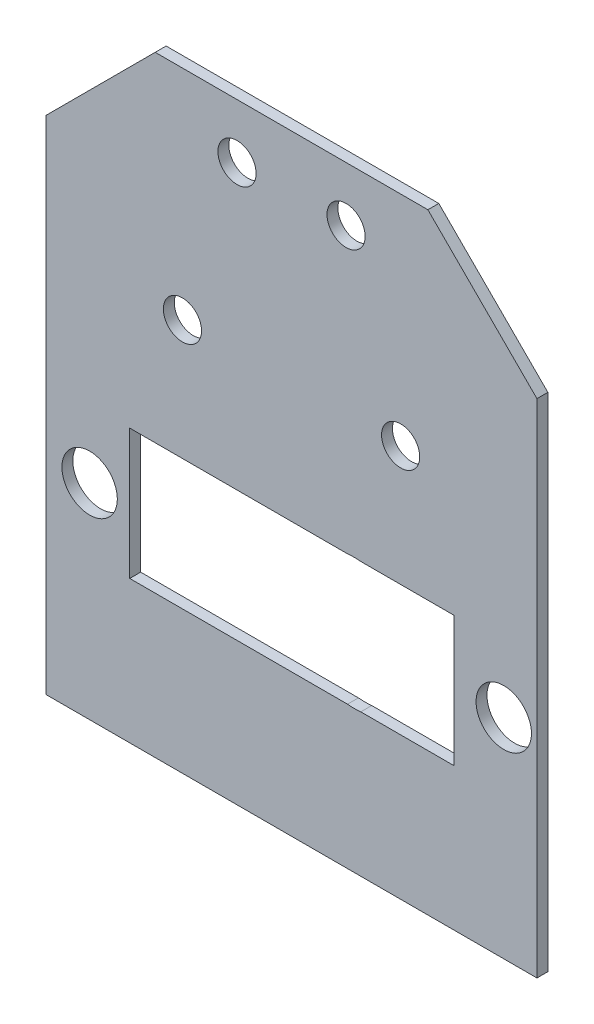
ISO-10303-21;
HEADER;
FILE_DESCRIPTION(('STEP AP214'),'2;1');
FILE_NAME('part.step','',(''),(''),'','','');
FILE_SCHEMA(('AUTOMOTIVE_DESIGN { 1 0 10303 214 1 1 1 1 }'));
ENDSEC;
DATA;
#1=APPLICATION_CONTEXT('core data for automotive mechanical design processes');
#2=APPLICATION_PROTOCOL_DEFINITION('international standard','automotive_design',2000,#1);
#3=PRODUCT_CONTEXT('',#1,'mechanical');
#4=PRODUCT('Part','Part','',(#3));
#5=PRODUCT_RELATED_PRODUCT_CATEGORY('part','',(#4));
#6=PRODUCT_DEFINITION_FORMATION('','',#4);
#7=PRODUCT_DEFINITION_CONTEXT('part definition',#1,'design');
#8=PRODUCT_DEFINITION('design','',#6,#7);
#9=PRODUCT_DEFINITION_SHAPE('','',#8);
#10=(LENGTH_UNIT() NAMED_UNIT(*) SI_UNIT(.MILLI.,.METRE.));
#11=(NAMED_UNIT(*) PLANE_ANGLE_UNIT() SI_UNIT($,.RADIAN.));
#12=(NAMED_UNIT(*) SI_UNIT($,.STERADIAN.) SOLID_ANGLE_UNIT());
#13=UNCERTAINTY_MEASURE_WITH_UNIT(LENGTH_MEASURE(1.E-05),#10,'distance_accuracy_value','');
#14=(GEOMETRIC_REPRESENTATION_CONTEXT(3) GLOBAL_UNCERTAINTY_ASSIGNED_CONTEXT((#13)) GLOBAL_UNIT_ASSIGNED_CONTEXT((#10,
#11,#12)) REPRESENTATION_CONTEXT('',''));
#15=CARTESIAN_POINT('',(0.,0.,0.));
#16=DIRECTION('',(0.,0.,1.));
#17=DIRECTION('',(1.,0.,0.));
#18=AXIS2_PLACEMENT_3D('',#15,#16,#17);
#19=CARTESIAN_POINT('',(5.73999999999999,-23.2649392617659,-1.));
#20=DIRECTION('',(0.,0.,1.));
#21=DIRECTION('',(1.,0.,0.));
#22=AXIS2_PLACEMENT_3D('',#19,#20,#21);
#23=CYLINDRICAL_SURFACE('',#22,6.);
#24=CARTESIAN_POINT('',(5.73999999999999,-23.2649392617659,0.));
#25=DIRECTION('',(0.,0.,1.));
#26=DIRECTION('',(1.,0.,0.));
#27=AXIS2_PLACEMENT_3D('',#24,#25,#26);
#28=CIRCLE('',#27,6.);
#29=CARTESIAN_POINT('',(6.34912970704187,-17.295939261766,0.));
#30=VERTEX_POINT('',#29);
#31=CARTESIAN_POINT('',(5.13087029295812,-17.295939261766,0.));
#32=VERTEX_POINT('',#31);
#33=EDGE_CURVE('E194',#30,#32,#28,.T.);
#34=ORIENTED_EDGE('',*,*,#33,.T.);
#35=DIRECTION('',(0.,0.,1.));
#36=VECTOR('',#35,1.);
#37=CARTESIAN_POINT('',(5.13087029295812,-17.295939261766,-1.));
#38=LINE('',#37,#36);
#39=CARTESIAN_POINT('',(5.13087029295812,-17.295939261766,-1.));
#40=VERTEX_POINT('',#39);
#41=EDGE_CURVE('E11',#32,#40,#38,.F.);
#42=ORIENTED_EDGE('',*,*,#41,.T.);
#43=CARTESIAN_POINT('',(5.73999999999999,-23.2649392617659,-1.));
#44=DIRECTION('',(0.,0.,1.));
#45=DIRECTION('',(1.,0.,0.));
#46=AXIS2_PLACEMENT_3D('',#43,#44,#45);
#47=CIRCLE('',#46,6.);
#48=CARTESIAN_POINT('',(6.34912970704187,-17.295939261766,-1.));
#49=VERTEX_POINT('',#48);
#50=EDGE_CURVE('E190',#49,#40,#47,.T.);
#51=ORIENTED_EDGE('',*,*,#50,.F.);
#52=DIRECTION('',(0.,0.,1.));
#53=VECTOR('',#52,1.);
#54=CARTESIAN_POINT('',(6.34912970704187,-17.295939261766,-1.));
#55=LINE('',#54,#53);
#56=EDGE_CURVE('E38',#49,#30,#55,.T.);
#57=ORIENTED_EDGE('',*,*,#56,.T.);
#58=EDGE_LOOP('',(#34,#42,#51,#57));
#59=FACE_BOUND('',#58,.T.);
#60=ADVANCED_FACE('F30',(#59),#23,.F.);
#61=CARTESIAN_POINT('',(-22.5,13.7086402075152,-1.));
#62=DIRECTION('',(0.,0.,1.));
#63=DIRECTION('',(-1.,0.,0.));
#64=AXIS2_PLACEMENT_3D('',#61,#62,#63);
#65=PLANE('',#64);
#66=CARTESIAN_POINT('',(19.4553569674763,-23.1321264055589,-1.));
#67=DIRECTION('',(0.,0.,1.));
#68=DIRECTION('',(1.,0.,0.));
#69=AXIS2_PLACEMENT_3D('',#66,#67,#68);
#70=CIRCLE('',#69,2.54000000000005);
#71=CARTESIAN_POINT('',(21.9953569674763,-23.1321264055589,-1.));
#72=VERTEX_POINT('',#71);
#73=EDGE_CURVE('E178',#72,#72,#70,.T.);
#74=ORIENTED_EDGE('',*,*,#73,.T.);
#75=EDGE_LOOP('',(#74));
#76=FACE_BOUND('',#75,.T.);
#77=CARTESIAN_POINT('',(-18.5136030637945,-23.4997993754212,-1.));
#78=DIRECTION('',(0.,0.,1.));
#79=DIRECTION('',(1.,0.,0.));
#80=AXIS2_PLACEMENT_3D('',#77,#78,#79);
#81=CIRCLE('',#80,2.54);
#82=CARTESIAN_POINT('',(-15.9736030637945,-23.4997993754212,-1.));
#83=VERTEX_POINT('',#82);
#84=EDGE_CURVE('E184',#83,#83,#81,.T.);
#85=ORIENTED_EDGE('',*,*,#84,.T.);
#86=EDGE_LOOP('',(#85));
#87=FACE_BOUND('',#86,.T.);
#88=ORIENTED_EDGE('',*,*,#50,.T.);
#89=DIRECTION('',(-1.,0.,0.));
#90=VECTOR('',#89,1.);
#91=CARTESIAN_POINT('',(-14.8339999999999,-17.295939261766,-1.));
#92=LINE('',#91,#90);
#93=CARTESIAN_POINT('',(-14.8339999999999,-17.295939261766,-1.));
#94=VERTEX_POINT('',#93);
#95=EDGE_CURVE('E155',#40,#94,#92,.T.);
#96=ORIENTED_EDGE('',*,*,#95,.T.);
#97=DIRECTION('',(0.,-1.,0.));
#98=VECTOR('',#97,1.);
#99=CARTESIAN_POINT('',(-14.8339999999999,-17.295939261766,-1.));
#100=LINE('',#99,#98);
#101=CARTESIAN_POINT('',(-14.8339999999999,-29.233939261766,-1.));
#102=VERTEX_POINT('',#101);
#103=EDGE_CURVE('E136',#94,#102,#100,.T.);
#104=ORIENTED_EDGE('',*,*,#103,.T.);
#105=DIRECTION('',(1.,0.,0.));
#106=VECTOR('',#105,1.);
#107=CARTESIAN_POINT('',(-14.8339999999999,-29.233939261766,-1.));
#108=LINE('',#107,#106);
#109=CARTESIAN_POINT('',(5.13087029295975,-29.233939261766,-1.));
#110=VERTEX_POINT('',#109);
#111=EDGE_CURVE('E144',#102,#110,#108,.T.);
#112=ORIENTED_EDGE('',*,*,#111,.T.);
#113=CARTESIAN_POINT('',(6.34912970704024,-29.233939261766,-1.));
#114=VERTEX_POINT('',#113);
#115=EDGE_CURVE('E193',#110,#114,#47,.T.);
#116=ORIENTED_EDGE('',*,*,#115,.T.);
#117=CARTESIAN_POINT('',(14.8840000000002,-29.233939261766,-1.));
#118=VERTEX_POINT('',#117);
#119=EDGE_CURVE('E53',#114,#118,#108,.T.);
#120=ORIENTED_EDGE('',*,*,#119,.T.);
#121=DIRECTION('',(0.,1.,0.));
#122=VECTOR('',#121,1.);
#123=CARTESIAN_POINT('',(14.8840000000002,-17.295939261766,-1.));
#124=LINE('',#123,#122);
#125=CARTESIAN_POINT('',(14.8840000000002,-17.295939261766,-1.));
#126=VERTEX_POINT('',#125);
#127=EDGE_CURVE('E150',#118,#126,#124,.T.);
#128=ORIENTED_EDGE('',*,*,#127,.T.);
#129=EDGE_CURVE('E141',#126,#49,#92,.T.);
#130=ORIENTED_EDGE('',*,*,#129,.T.);
#131=EDGE_LOOP('',(#88,#96,#104,#112,#116,#120,#128,#130));
#132=FACE_BOUND('',#131,.T.);
#133=CARTESIAN_POINT('',(10.,-6.29135979248479,-1.));
#134=DIRECTION('',(0.,0.,1.));
#135=DIRECTION('',(1.,0.,0.));
#136=AXIS2_PLACEMENT_3D('',#133,#134,#135);
#137=CIRCLE('',#136,1.75);
#138=CARTESIAN_POINT('',(11.75,-6.29135979248479,-1.));
#139=VERTEX_POINT('',#138);
#140=EDGE_CURVE('E203',#139,#139,#137,.T.);
#141=ORIENTED_EDGE('',*,*,#140,.T.);
#142=EDGE_LOOP('',(#141));
#143=FACE_BOUND('',#142,.T.);
#144=CARTESIAN_POINT('',(-4.99999999999999,8.7086402075152,-1.));
#145=DIRECTION('',(0.,0.,1.));
#146=DIRECTION('',(1.,0.,0.));
#147=AXIS2_PLACEMENT_3D('',#144,#145,#146);
#148=CIRCLE('',#147,1.75);
#149=CARTESIAN_POINT('',(-3.24999999999999,8.7086402075152,-1.));
#150=VERTEX_POINT('',#149);
#151=EDGE_CURVE('E215',#150,#150,#148,.T.);
#152=ORIENTED_EDGE('',*,*,#151,.T.);
#153=EDGE_LOOP('',(#152));
#154=FACE_BOUND('',#153,.T.);
#155=DIRECTION('',(0.,-1.,0.));
#156=VECTOR('',#155,1.);
#157=CARTESIAN_POINT('',(-22.5,-42.2913597924848,-1.));
#158=LINE('',#157,#156);
#159=CARTESIAN_POINT('',(-22.5,3.70864020751521,-1.));
#160=VERTEX_POINT('',#159);
#161=CARTESIAN_POINT('',(-22.5,-42.2913597924848,-1.));
#162=VERTEX_POINT('',#161);
#163=EDGE_CURVE('E221',#160,#162,#158,.T.);
#164=ORIENTED_EDGE('',*,*,#163,.F.);
#165=DIRECTION('',(-0.707106781186547,-0.707106781186548,0.));
#166=VECTOR('',#165,1.);
#167=CARTESIAN_POINT('',(-22.5,3.70864020751521,-1.));
#168=LINE('',#167,#166);
#169=CARTESIAN_POINT('',(-12.5,13.7086402075152,-1.));
#170=VERTEX_POINT('',#169);
#171=EDGE_CURVE('E237',#170,#160,#168,.T.);
#172=ORIENTED_EDGE('',*,*,#171,.F.);
#173=DIRECTION('',(-1.,0.,0.));
#174=VECTOR('',#173,1.);
#175=CARTESIAN_POINT('',(-12.5,13.7086402075152,-1.));
#176=LINE('',#175,#174);
#177=CARTESIAN_POINT('',(12.5,13.7086402075152,-1.));
#178=VERTEX_POINT('',#177);
#179=EDGE_CURVE('E234',#178,#170,#176,.T.);
#180=ORIENTED_EDGE('',*,*,#179,.F.);
#181=DIRECTION('',(-0.707106781186548,0.707106781186547,0.));
#182=VECTOR('',#181,1.);
#183=CARTESIAN_POINT('',(12.5,13.7086402075152,-1.));
#184=LINE('',#183,#182);
#185=CARTESIAN_POINT('',(22.5,3.70864020751521,-1.));
#186=VERTEX_POINT('',#185);
#187=EDGE_CURVE('E231',#186,#178,#184,.T.);
#188=ORIENTED_EDGE('',*,*,#187,.F.);
#189=DIRECTION('',(0.,1.,0.));
#190=VECTOR('',#189,1.);
#191=CARTESIAN_POINT('',(22.5,-42.2913597924848,-1.));
#192=LINE('',#191,#190);
#193=CARTESIAN_POINT('',(22.5,-42.2913597924848,-1.));
#194=VERTEX_POINT('',#193);
#195=EDGE_CURVE('E228',#194,#186,#192,.T.);
#196=ORIENTED_EDGE('',*,*,#195,.F.);
#197=DIRECTION('',(1.,0.,0.));
#198=VECTOR('',#197,1.);
#199=CARTESIAN_POINT('',(-22.5,-42.2913597924848,-1.));
#200=LINE('',#199,#198);
#201=EDGE_CURVE('E224',#162,#194,#200,.T.);
#202=ORIENTED_EDGE('',*,*,#201,.F.);
#203=EDGE_LOOP('',(#164,#172,#180,#188,#196,#202));
#204=FACE_BOUND('',#203,.T.);
#205=CARTESIAN_POINT('',(5.00000000000001,8.7086402075152,-1.));
#206=DIRECTION('',(0.,0.,1.));
#207=DIRECTION('',(1.,0.,0.));
#208=AXIS2_PLACEMENT_3D('',#205,#206,#207);
#209=CIRCLE('',#208,1.75);
#210=CARTESIAN_POINT('',(6.75000000000001,8.7086402075152,-1.));
#211=VERTEX_POINT('',#210);
#212=EDGE_CURVE('E209',#211,#211,#209,.T.);
#213=ORIENTED_EDGE('',*,*,#212,.T.);
#214=EDGE_LOOP('',(#213));
#215=FACE_BOUND('',#214,.T.);
#216=CARTESIAN_POINT('',(-9.99999999999999,-6.29135979248479,-1.));
#217=DIRECTION('',(0.,0.,1.));
#218=DIRECTION('',(1.,0.,0.));
#219=AXIS2_PLACEMENT_3D('',#216,#217,#218);
#220=CIRCLE('',#219,1.75);
#221=CARTESIAN_POINT('',(-8.24999999999999,-6.29135979248479,-1.));
#222=VERTEX_POINT('',#221);
#223=EDGE_CURVE('E197',#222,#222,#220,.T.);
#224=ORIENTED_EDGE('',*,*,#223,.T.);
#225=EDGE_LOOP('',(#224));
#226=FACE_BOUND('',#225,.T.);
#227=ADVANCED_FACE('F153',(#76,#87,#132,#143,#154,#204,#215,#226),#65,.F.);
#228=CARTESIAN_POINT('',(-22.5,13.7086402075152,0.));
#229=DIRECTION('',(0.,0.,1.));
#230=DIRECTION('',(-1.,0.,0.));
#231=AXIS2_PLACEMENT_3D('',#228,#229,#230);
#232=PLANE('',#231);
#233=DIRECTION('',(-1.,0.,0.));
#234=VECTOR('',#233,1.);
#235=CARTESIAN_POINT('',(-14.8339999999999,-17.295939261766,0.));
#236=LINE('',#235,#234);
#237=CARTESIAN_POINT('',(-14.8339999999999,-17.295939261766,0.));
#238=VERTEX_POINT('',#237);
#239=EDGE_CURVE('E158',#32,#238,#236,.T.);
#240=ORIENTED_EDGE('',*,*,#239,.F.);
#241=ORIENTED_EDGE('',*,*,#33,.F.);
#242=CARTESIAN_POINT('',(14.8840000000002,-17.295939261766,0.));
#243=VERTEX_POINT('',#242);
#244=EDGE_CURVE('E156',#243,#30,#236,.T.);
#245=ORIENTED_EDGE('',*,*,#244,.F.);
#246=DIRECTION('',(0.,1.,0.));
#247=VECTOR('',#246,1.);
#248=CARTESIAN_POINT('',(14.8840000000002,-17.295939261766,0.));
#249=LINE('',#248,#247);
#250=CARTESIAN_POINT('',(14.8840000000002,-29.233939261766,0.));
#251=VERTEX_POINT('',#250);
#252=EDGE_CURVE('E168',#251,#243,#249,.T.);
#253=ORIENTED_EDGE('',*,*,#252,.F.);
#254=DIRECTION('',(1.,0.,0.));
#255=VECTOR('',#254,1.);
#256=CARTESIAN_POINT('',(-14.8339999999999,-29.233939261766,0.));
#257=LINE('',#256,#255);
#258=CARTESIAN_POINT('',(6.34912970704024,-29.233939261766,0.));
#259=VERTEX_POINT('',#258);
#260=EDGE_CURVE('E166',#259,#251,#257,.T.);
#261=ORIENTED_EDGE('',*,*,#260,.F.);
#262=CARTESIAN_POINT('',(5.13087029295975,-29.233939261766,0.));
#263=VERTEX_POINT('',#262);
#264=EDGE_CURVE('E187',#263,#259,#28,.T.);
#265=ORIENTED_EDGE('',*,*,#264,.F.);
#266=CARTESIAN_POINT('',(-14.8339999999999,-29.233939261766,0.));
#267=VERTEX_POINT('',#266);
#268=EDGE_CURVE('E45',#267,#263,#257,.T.);
#269=ORIENTED_EDGE('',*,*,#268,.F.);
#270=DIRECTION('',(0.,-1.,0.));
#271=VECTOR('',#270,1.);
#272=CARTESIAN_POINT('',(-14.8339999999999,-17.295939261766,0.));
#273=LINE('',#272,#271);
#274=EDGE_CURVE('E139',#238,#267,#273,.T.);
#275=ORIENTED_EDGE('',*,*,#274,.F.);
#276=EDGE_LOOP('',(#240,#241,#245,#253,#261,#265,#269,#275));
#277=FACE_BOUND('',#276,.T.);
#278=CARTESIAN_POINT('',(19.4553569674763,-23.1321264055589,0.));
#279=DIRECTION('',(0.,0.,1.));
#280=DIRECTION('',(1.,0.,0.));
#281=AXIS2_PLACEMENT_3D('',#278,#279,#280);
#282=CIRCLE('',#281,2.54000000000005);
#283=CARTESIAN_POINT('',(21.9953569674763,-23.1321264055589,0.));
#284=VERTEX_POINT('',#283);
#285=EDGE_CURVE('E173',#284,#284,#282,.T.);
#286=ORIENTED_EDGE('',*,*,#285,.F.);
#287=EDGE_LOOP('',(#286));
#288=FACE_BOUND('',#287,.T.);
#289=CARTESIAN_POINT('',(-18.5136030637945,-23.4997993754212,0.));
#290=DIRECTION('',(0.,0.,1.));
#291=DIRECTION('',(1.,0.,0.));
#292=AXIS2_PLACEMENT_3D('',#289,#290,#291);
#293=CIRCLE('',#292,2.54);
#294=CARTESIAN_POINT('',(-15.9736030637945,-23.4997993754212,0.));
#295=VERTEX_POINT('',#294);
#296=EDGE_CURVE('E181',#295,#295,#293,.T.);
#297=ORIENTED_EDGE('',*,*,#296,.F.);
#298=EDGE_LOOP('',(#297));
#299=FACE_BOUND('',#298,.T.);
#300=CARTESIAN_POINT('',(10.,-6.29135979248479,0.));
#301=DIRECTION('',(0.,0.,1.));
#302=DIRECTION('',(1.,0.,0.));
#303=AXIS2_PLACEMENT_3D('',#300,#301,#302);
#304=CIRCLE('',#303,1.75);
#305=CARTESIAN_POINT('',(11.75,-6.29135979248479,0.));
#306=VERTEX_POINT('',#305);
#307=EDGE_CURVE('E200',#306,#306,#304,.T.);
#308=ORIENTED_EDGE('',*,*,#307,.F.);
#309=EDGE_LOOP('',(#308));
#310=FACE_BOUND('',#309,.T.);
#311=CARTESIAN_POINT('',(-4.99999999999999,8.7086402075152,0.));
#312=DIRECTION('',(0.,0.,1.));
#313=DIRECTION('',(1.,0.,0.));
#314=AXIS2_PLACEMENT_3D('',#311,#312,#313);
#315=CIRCLE('',#314,1.75);
#316=CARTESIAN_POINT('',(-3.24999999999999,8.7086402075152,0.));
#317=VERTEX_POINT('',#316);
#318=EDGE_CURVE('E212',#317,#317,#315,.T.);
#319=ORIENTED_EDGE('',*,*,#318,.F.);
#320=EDGE_LOOP('',(#319));
#321=FACE_BOUND('',#320,.T.);
#322=DIRECTION('',(0.,-1.,0.));
#323=VECTOR('',#322,1.);
#324=CARTESIAN_POINT('',(-22.5,-42.2913597924848,0.));
#325=LINE('',#324,#323);
#326=CARTESIAN_POINT('',(-22.5,3.70864020751521,0.));
#327=VERTEX_POINT('',#326);
#328=CARTESIAN_POINT('',(-22.5,-42.2913597924848,0.));
#329=VERTEX_POINT('',#328);
#330=EDGE_CURVE('E218',#327,#329,#325,.T.);
#331=ORIENTED_EDGE('',*,*,#330,.T.);
#332=DIRECTION('',(1.,0.,0.));
#333=VECTOR('',#332,1.);
#334=CARTESIAN_POINT('',(-22.5,-42.2913597924848,0.));
#335=LINE('',#334,#333);
#336=CARTESIAN_POINT('',(22.5,-42.2913597924848,0.));
#337=VERTEX_POINT('',#336);
#338=EDGE_CURVE('E243',#329,#337,#335,.T.);
#339=ORIENTED_EDGE('',*,*,#338,.T.);
#340=DIRECTION('',(0.,1.,0.));
#341=VECTOR('',#340,1.);
#342=CARTESIAN_POINT('',(22.5,-42.2913597924848,0.));
#343=LINE('',#342,#341);
#344=CARTESIAN_POINT('',(22.5,3.70864020751521,0.));
#345=VERTEX_POINT('',#344);
#346=EDGE_CURVE('E246',#337,#345,#343,.T.);
#347=ORIENTED_EDGE('',*,*,#346,.T.);
#348=DIRECTION('',(-0.707106781186548,0.707106781186547,0.));
#349=VECTOR('',#348,1.);
#350=CARTESIAN_POINT('',(12.5,13.7086402075152,0.));
#351=LINE('',#350,#349);
#352=CARTESIAN_POINT('',(12.5,13.7086402075152,0.));
#353=VERTEX_POINT('',#352);
#354=EDGE_CURVE('E249',#345,#353,#351,.T.);
#355=ORIENTED_EDGE('',*,*,#354,.T.);
#356=DIRECTION('',(-1.,0.,0.));
#357=VECTOR('',#356,1.);
#358=CARTESIAN_POINT('',(-12.5,13.7086402075152,0.));
#359=LINE('',#358,#357);
#360=CARTESIAN_POINT('',(-12.5,13.7086402075152,0.));
#361=VERTEX_POINT('',#360);
#362=EDGE_CURVE('E252',#353,#361,#359,.T.);
#363=ORIENTED_EDGE('',*,*,#362,.T.);
#364=DIRECTION('',(-0.707106781186547,-0.707106781186548,0.));
#365=VECTOR('',#364,1.);
#366=CARTESIAN_POINT('',(-22.5,3.70864020751521,0.));
#367=LINE('',#366,#365);
#368=EDGE_CURVE('E225',#361,#327,#367,.T.);
#369=ORIENTED_EDGE('',*,*,#368,.T.);
#370=EDGE_LOOP('',(#331,#339,#347,#355,#363,#369));
#371=FACE_BOUND('',#370,.T.);
#372=CARTESIAN_POINT('',(5.00000000000001,8.7086402075152,0.));
#373=DIRECTION('',(0.,0.,1.));
#374=DIRECTION('',(1.,0.,0.));
#375=AXIS2_PLACEMENT_3D('',#372,#373,#374);
#376=CIRCLE('',#375,1.75);
#377=CARTESIAN_POINT('',(6.75000000000001,8.7086402075152,0.));
#378=VERTEX_POINT('',#377);
#379=EDGE_CURVE('E206',#378,#378,#376,.T.);
#380=ORIENTED_EDGE('',*,*,#379,.F.);
#381=EDGE_LOOP('',(#380));
#382=FACE_BOUND('',#381,.T.);
#383=CARTESIAN_POINT('',(-9.99999999999999,-6.29135979248479,0.));
#384=DIRECTION('',(0.,0.,1.));
#385=DIRECTION('',(1.,0.,0.));
#386=AXIS2_PLACEMENT_3D('',#383,#384,#385);
#387=CIRCLE('',#386,1.75);
#388=CARTESIAN_POINT('',(-8.24999999999999,-6.29135979248479,0.));
#389=VERTEX_POINT('',#388);
#390=EDGE_CURVE('E192',#389,#389,#387,.T.);
#391=ORIENTED_EDGE('',*,*,#390,.F.);
#392=EDGE_LOOP('',(#391));
#393=FACE_BOUND('',#392,.T.);
#394=ADVANCED_FACE('F279',(#277,#288,#299,#310,#321,#371,#382,#393),#232,.T.);
#395=CARTESIAN_POINT('',(-22.5,-42.2913597924848,-1.));
#396=DIRECTION('',(1.,0.,0.));
#397=DIRECTION('',(0.,0.,1.));
#398=AXIS2_PLACEMENT_3D('',#395,#396,#397);
#399=PLANE('',#398);
#400=ORIENTED_EDGE('',*,*,#330,.F.);
#401=DIRECTION('',(0.,0.,1.));
#402=VECTOR('',#401,1.);
#403=CARTESIAN_POINT('',(-22.5,3.70864020751521,-1.));
#404=LINE('',#403,#402);
#405=EDGE_CURVE('E240',#160,#327,#404,.T.);
#406=ORIENTED_EDGE('',*,*,#405,.F.);
#407=ORIENTED_EDGE('',*,*,#163,.T.);
#408=DIRECTION('',(0.,0.,1.));
#409=VECTOR('',#408,1.);
#410=CARTESIAN_POINT('',(-22.5,-42.2913597924848,-1.));
#411=LINE('',#410,#409);
#412=EDGE_CURVE('E266',#162,#329,#411,.T.);
#413=ORIENTED_EDGE('',*,*,#412,.T.);
#414=EDGE_LOOP('',(#400,#406,#407,#413));
#415=FACE_BOUND('',#414,.T.);
#416=ADVANCED_FACE('F32',(#415),#399,.F.);
#417=CARTESIAN_POINT('',(-22.5,-42.2913597924848,-1.));
#418=DIRECTION('',(0.,1.,0.));
#419=DIRECTION('',(0.,0.,-1.));
#420=AXIS2_PLACEMENT_3D('',#417,#418,#419);
#421=PLANE('',#420);
#422=ORIENTED_EDGE('',*,*,#338,.F.);
#423=ORIENTED_EDGE('',*,*,#412,.F.);
#424=ORIENTED_EDGE('',*,*,#201,.T.);
#425=DIRECTION('',(0.,0.,1.));
#426=VECTOR('',#425,1.);
#427=CARTESIAN_POINT('',(22.5,-42.2913597924848,-1.));
#428=LINE('',#427,#426);
#429=EDGE_CURVE('E264',#194,#337,#428,.T.);
#430=ORIENTED_EDGE('',*,*,#429,.T.);
#431=EDGE_LOOP('',(#422,#423,#424,#430));
#432=FACE_BOUND('',#431,.T.);
#433=ADVANCED_FACE('F356',(#432),#421,.F.);
#434=CARTESIAN_POINT('',(22.5,-42.2913597924848,-1.));
#435=DIRECTION('',(-1.,0.,0.));
#436=DIRECTION('',(0.,0.,-1.));
#437=AXIS2_PLACEMENT_3D('',#434,#435,#436);
#438=PLANE('',#437);
#439=ORIENTED_EDGE('',*,*,#346,.F.);
#440=ORIENTED_EDGE('',*,*,#429,.F.);
#441=ORIENTED_EDGE('',*,*,#195,.T.);
#442=DIRECTION('',(0.,0.,1.));
#443=VECTOR('',#442,1.);
#444=CARTESIAN_POINT('',(22.5,3.70864020751521,-1.));
#445=LINE('',#444,#443);
#446=EDGE_CURVE('E262',#186,#345,#445,.T.);
#447=ORIENTED_EDGE('',*,*,#446,.T.);
#448=EDGE_LOOP('',(#439,#440,#441,#447));
#449=FACE_BOUND('',#448,.T.);
#450=ADVANCED_FACE('F353',(#449),#438,.F.);
#451=CARTESIAN_POINT('',(12.5,13.7086402075152,-1.));
#452=DIRECTION('',(-0.707106781186547,-0.707106781186548,0.));
#453=DIRECTION('',(0.707106781186548,-0.707106781186547,0.));
#454=AXIS2_PLACEMENT_3D('',#451,#452,#453);
#455=PLANE('',#454);
#456=ORIENTED_EDGE('',*,*,#354,.F.);
#457=ORIENTED_EDGE('',*,*,#446,.F.);
#458=ORIENTED_EDGE('',*,*,#187,.T.);
#459=DIRECTION('',(0.,0.,1.));
#460=VECTOR('',#459,1.);
#461=CARTESIAN_POINT('',(12.5,13.7086402075152,-1.));
#462=LINE('',#461,#460);
#463=EDGE_CURVE('E260',#178,#353,#462,.T.);
#464=ORIENTED_EDGE('',*,*,#463,.T.);
#465=EDGE_LOOP('',(#456,#457,#458,#464));
#466=FACE_BOUND('',#465,.T.);
#467=ADVANCED_FACE('F349',(#466),#455,.F.);
#468=CARTESIAN_POINT('',(-12.5,13.7086402075152,-1.));
#469=DIRECTION('',(0.,-1.,0.));
#470=DIRECTION('',(0.,0.,1.));
#471=AXIS2_PLACEMENT_3D('',#468,#469,#470);
#472=PLANE('',#471);
#473=ORIENTED_EDGE('',*,*,#362,.F.);
#474=ORIENTED_EDGE('',*,*,#463,.F.);
#475=ORIENTED_EDGE('',*,*,#179,.T.);
#476=DIRECTION('',(0.,0.,1.));
#477=VECTOR('',#476,1.);
#478=CARTESIAN_POINT('',(-12.5,13.7086402075152,-1.));
#479=LINE('',#478,#477);
#480=EDGE_CURVE('E258',#170,#361,#479,.T.);
#481=ORIENTED_EDGE('',*,*,#480,.T.);
#482=EDGE_LOOP('',(#473,#474,#475,#481));
#483=FACE_BOUND('',#482,.T.);
#484=ADVANCED_FACE('F345',(#483),#472,.F.);
#485=CARTESIAN_POINT('',(-22.5,3.70864020751521,-1.));
#486=DIRECTION('',(0.707106781186548,-0.707106781186547,0.));
#487=DIRECTION('',(0.707106781186547,0.707106781186548,0.));
#488=AXIS2_PLACEMENT_3D('',#485,#486,#487);
#489=PLANE('',#488);
#490=ORIENTED_EDGE('',*,*,#368,.F.);
#491=ORIENTED_EDGE('',*,*,#480,.F.);
#492=ORIENTED_EDGE('',*,*,#171,.T.);
#493=ORIENTED_EDGE('',*,*,#405,.T.);
#494=EDGE_LOOP('',(#490,#491,#492,#493));
#495=FACE_BOUND('',#494,.T.);
#496=ADVANCED_FACE('F338',(#495),#489,.F.);
#497=CARTESIAN_POINT('',(-4.99999999999999,8.7086402075152,-1.));
#498=DIRECTION('',(0.,0.,1.));
#499=DIRECTION('',(-1.,0.,0.));
#500=AXIS2_PLACEMENT_3D('',#497,#498,#499);
#501=CYLINDRICAL_SURFACE('',#500,1.75);
#502=ORIENTED_EDGE('',*,*,#151,.F.);
#503=EDGE_LOOP('',(#502));
#504=FACE_BOUND('',#503,.T.);
#505=ORIENTED_EDGE('',*,*,#318,.T.);
#506=EDGE_LOOP('',(#505));
#507=FACE_BOUND('',#506,.T.);
#508=ADVANCED_FACE('F335',(#504,#507),#501,.F.);
#509=CARTESIAN_POINT('',(5.00000000000001,8.7086402075152,-1.));
#510=DIRECTION('',(0.,0.,1.));
#511=DIRECTION('',(-1.,0.,0.));
#512=AXIS2_PLACEMENT_3D('',#509,#510,#511);
#513=CYLINDRICAL_SURFACE('',#512,1.75);
#514=ORIENTED_EDGE('',*,*,#212,.F.);
#515=EDGE_LOOP('',(#514));
#516=FACE_BOUND('',#515,.T.);
#517=ORIENTED_EDGE('',*,*,#379,.T.);
#518=EDGE_LOOP('',(#517));
#519=FACE_BOUND('',#518,.T.);
#520=ADVANCED_FACE('F327',(#516,#519),#513,.F.);
#521=CARTESIAN_POINT('',(10.,-6.29135979248479,-1.));
#522=DIRECTION('',(0.,0.,1.));
#523=DIRECTION('',(-1.,0.,0.));
#524=AXIS2_PLACEMENT_3D('',#521,#522,#523);
#525=CYLINDRICAL_SURFACE('',#524,1.75);
#526=ORIENTED_EDGE('',*,*,#140,.F.);
#527=EDGE_LOOP('',(#526));
#528=FACE_BOUND('',#527,.T.);
#529=ORIENTED_EDGE('',*,*,#307,.T.);
#530=EDGE_LOOP('',(#529));
#531=FACE_BOUND('',#530,.T.);
#532=ADVANCED_FACE('F322',(#528,#531),#525,.F.);
#533=CARTESIAN_POINT('',(-9.99999999999999,-6.29135979248479,-1.));
#534=DIRECTION('',(0.,0.,1.));
#535=DIRECTION('',(-1.,0.,0.));
#536=AXIS2_PLACEMENT_3D('',#533,#534,#535);
#537=CYLINDRICAL_SURFACE('',#536,1.75);
#538=ORIENTED_EDGE('',*,*,#223,.F.);
#539=EDGE_LOOP('',(#538));
#540=FACE_BOUND('',#539,.T.);
#541=ORIENTED_EDGE('',*,*,#390,.T.);
#542=EDGE_LOOP('',(#541));
#543=FACE_BOUND('',#542,.T.);
#544=ADVANCED_FACE('F316',(#540,#543),#537,.F.);
#545=ORIENTED_EDGE('',*,*,#264,.T.);
#546=DIRECTION('',(0.,0.,1.));
#547=VECTOR('',#546,1.);
#548=CARTESIAN_POINT('',(6.34912970704024,-29.233939261766,-1.));
#549=LINE('',#548,#547);
#550=EDGE_CURVE('E269',#259,#114,#549,.F.);
#551=ORIENTED_EDGE('',*,*,#550,.T.);
#552=ORIENTED_EDGE('',*,*,#115,.F.);
#553=DIRECTION('',(0.,0.,1.));
#554=VECTOR('',#553,1.);
#555=CARTESIAN_POINT('',(5.13087029295975,-29.233939261766,-1.));
#556=LINE('',#555,#554);
#557=EDGE_CURVE('E146',#110,#263,#556,.T.);
#558=ORIENTED_EDGE('',*,*,#557,.T.);
#559=EDGE_LOOP('',(#545,#551,#552,#558));
#560=FACE_BOUND('',#559,.T.);
#561=ADVANCED_FACE('F292',(#560),#23,.F.);
#562=CARTESIAN_POINT('',(-18.5136030637945,-23.4997993754212,-1.));
#563=DIRECTION('',(0.,0.,1.));
#564=DIRECTION('',(1.,0.,0.));
#565=AXIS2_PLACEMENT_3D('',#562,#563,#564);
#566=CYLINDRICAL_SURFACE('',#565,2.54);
#567=ORIENTED_EDGE('',*,*,#84,.F.);
#568=EDGE_LOOP('',(#567));
#569=FACE_BOUND('',#568,.T.);
#570=ORIENTED_EDGE('',*,*,#296,.T.);
#571=EDGE_LOOP('',(#570));
#572=FACE_BOUND('',#571,.T.);
#573=ADVANCED_FACE('F315',(#569,#572),#566,.F.);
#574=CARTESIAN_POINT('',(19.4553569674763,-23.1321264055589,-1.));
#575=DIRECTION('',(0.,0.,1.));
#576=DIRECTION('',(1.,0.,0.));
#577=AXIS2_PLACEMENT_3D('',#574,#575,#576);
#578=CYLINDRICAL_SURFACE('',#577,2.54000000000005);
#579=ORIENTED_EDGE('',*,*,#73,.F.);
#580=EDGE_LOOP('',(#579));
#581=FACE_BOUND('',#580,.T.);
#582=ORIENTED_EDGE('',*,*,#285,.T.);
#583=EDGE_LOOP('',(#582));
#584=FACE_BOUND('',#583,.T.);
#585=ADVANCED_FACE('F304',(#581,#584),#578,.F.);
#586=CARTESIAN_POINT('',(-14.8339999999999,-29.233939261766,-1.));
#587=DIRECTION('',(0.,-1.,0.));
#588=DIRECTION('',(0.,0.,-1.));
#589=AXIS2_PLACEMENT_3D('',#586,#587,#588);
#590=PLANE('',#589);
#591=ORIENTED_EDGE('',*,*,#111,.F.);
#592=DIRECTION('',(0.,0.,1.));
#593=VECTOR('',#592,1.);
#594=CARTESIAN_POINT('',(-14.8339999999999,-29.233939261766,-1.));
#595=LINE('',#594,#593);
#596=EDGE_CURVE('E131',#102,#267,#595,.T.);
#597=ORIENTED_EDGE('',*,*,#596,.T.);
#598=ORIENTED_EDGE('',*,*,#268,.T.);
#599=ORIENTED_EDGE('',*,*,#557,.F.);
#600=EDGE_LOOP('',(#591,#597,#598,#599));
#601=FACE_BOUND('',#600,.T.);
#602=ADVANCED_FACE('F145',(#601),#590,.F.);
#603=CARTESIAN_POINT('',(-14.8339999999999,-17.295939261766,-1.));
#604=DIRECTION('',(0.,1.,0.));
#605=DIRECTION('',(0.,0.,1.));
#606=AXIS2_PLACEMENT_3D('',#603,#604,#605);
#607=PLANE('',#606);
#608=ORIENTED_EDGE('',*,*,#239,.T.);
#609=DIRECTION('',(0.,0.,1.));
#610=VECTOR('',#609,1.);
#611=CARTESIAN_POINT('',(-14.8339999999999,-17.295939261766,-1.));
#612=LINE('',#611,#610);
#613=EDGE_CURVE('E171',#94,#238,#612,.T.);
#614=ORIENTED_EDGE('',*,*,#613,.F.);
#615=ORIENTED_EDGE('',*,*,#95,.F.);
#616=ORIENTED_EDGE('',*,*,#41,.F.);
#617=EDGE_LOOP('',(#608,#614,#615,#616));
#618=FACE_BOUND('',#617,.T.);
#619=ADVANCED_FACE('F283',(#618),#607,.F.);
#620=CARTESIAN_POINT('',(-14.8339999999999,-17.295939261766,-1.));
#621=DIRECTION('',(-1.,0.,0.));
#622=DIRECTION('',(0.,0.,1.));
#623=AXIS2_PLACEMENT_3D('',#620,#621,#622);
#624=PLANE('',#623);
#625=ORIENTED_EDGE('',*,*,#274,.T.);
#626=ORIENTED_EDGE('',*,*,#596,.F.);
#627=ORIENTED_EDGE('',*,*,#103,.F.);
#628=ORIENTED_EDGE('',*,*,#613,.T.);
#629=EDGE_LOOP('',(#625,#626,#627,#628));
#630=FACE_BOUND('',#629,.T.);
#631=ADVANCED_FACE('F133',(#630),#624,.F.);
#632=ORIENTED_EDGE('',*,*,#129,.F.);
#633=DIRECTION('',(0.,0.,1.));
#634=VECTOR('',#633,1.);
#635=CARTESIAN_POINT('',(14.8840000000002,-17.295939261766,-1.));
#636=LINE('',#635,#634);
#637=EDGE_CURVE('E174',#126,#243,#636,.T.);
#638=ORIENTED_EDGE('',*,*,#637,.T.);
#639=ORIENTED_EDGE('',*,*,#244,.T.);
#640=ORIENTED_EDGE('',*,*,#56,.F.);
#641=EDGE_LOOP('',(#632,#638,#639,#640));
#642=FACE_BOUND('',#641,.T.);
#643=ADVANCED_FACE('F285',(#642),#607,.F.);
#644=ORIENTED_EDGE('',*,*,#260,.T.);
#645=DIRECTION('',(0.,0.,1.));
#646=VECTOR('',#645,1.);
#647=CARTESIAN_POINT('',(14.8840000000002,-29.233939261766,-1.));
#648=LINE('',#647,#646);
#649=EDGE_CURVE('E140',#118,#251,#648,.T.);
#650=ORIENTED_EDGE('',*,*,#649,.F.);
#651=ORIENTED_EDGE('',*,*,#119,.F.);
#652=ORIENTED_EDGE('',*,*,#550,.F.);
#653=EDGE_LOOP('',(#644,#650,#651,#652));
#654=FACE_BOUND('',#653,.T.);
#655=ADVANCED_FACE('F293',(#654),#590,.F.);
#656=CARTESIAN_POINT('',(14.8840000000002,-17.295939261766,-1.));
#657=DIRECTION('',(1.,0.,0.));
#658=DIRECTION('',(0.,1.,0.));
#659=AXIS2_PLACEMENT_3D('',#656,#657,#658);
#660=PLANE('',#659);
#661=ORIENTED_EDGE('',*,*,#252,.T.);
#662=ORIENTED_EDGE('',*,*,#637,.F.);
#663=ORIENTED_EDGE('',*,*,#127,.F.);
#664=ORIENTED_EDGE('',*,*,#649,.T.);
#665=EDGE_LOOP('',(#661,#662,#663,#664));
#666=FACE_BOUND('',#665,.T.);
#667=ADVANCED_FACE('F287',(#666),#660,.F.);
#668=CLOSED_SHELL('',(#60,#227,#394,#416,#433,#450,#467,#484,#496,#508,#520,#532,#544,#561,#573,
#585,#602,#619,#631,#643,#655,#667));
#669=MANIFOLD_SOLID_BREP('B2',#668);
#670=ADVANCED_BREP_SHAPE_REPRESENTATION('',(#18,#669),#14);
#671=SHAPE_DEFINITION_REPRESENTATION(#9,#670);
ENDSEC;
END-ISO-10303-21;
